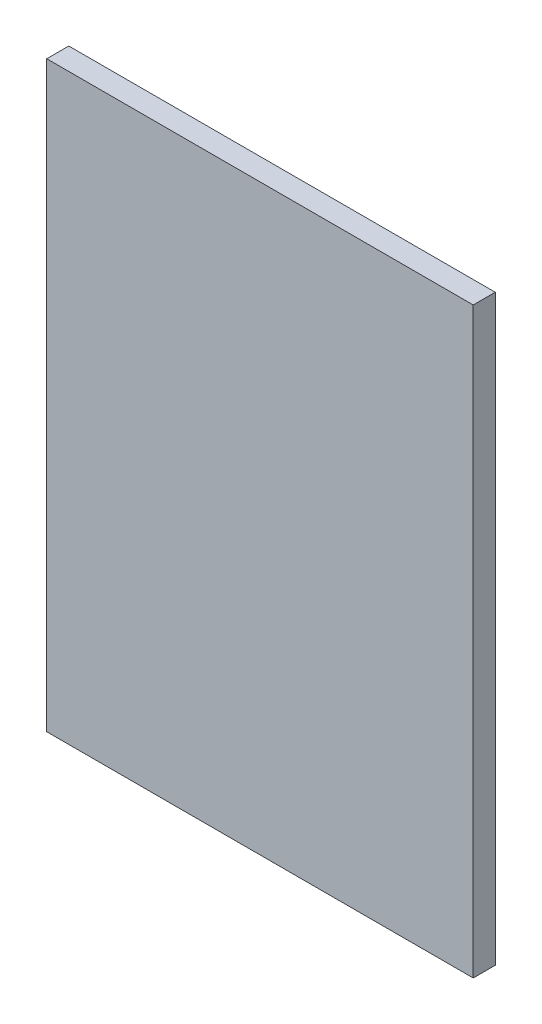
ISO-10303-21;
HEADER;
FILE_DESCRIPTION(('STEP AP214'),'2;1');
FILE_NAME('part.step','',(''),(''),'','','');
FILE_SCHEMA(('AUTOMOTIVE_DESIGN { 1 0 10303 214 1 1 1 1 }'));
ENDSEC;
DATA;
#1=APPLICATION_CONTEXT('core data for automotive mechanical design processes');
#2=APPLICATION_PROTOCOL_DEFINITION('international standard','automotive_design',2000,#1);
#3=PRODUCT_CONTEXT('',#1,'mechanical');
#4=PRODUCT('Part','Part','',(#3));
#5=PRODUCT_RELATED_PRODUCT_CATEGORY('part','',(#4));
#6=PRODUCT_DEFINITION_FORMATION('','',#4);
#7=PRODUCT_DEFINITION_CONTEXT('part definition',#1,'design');
#8=PRODUCT_DEFINITION('design','',#6,#7);
#9=PRODUCT_DEFINITION_SHAPE('','',#8);
#10=(LENGTH_UNIT() NAMED_UNIT(*) SI_UNIT(.MILLI.,.METRE.));
#11=(NAMED_UNIT(*) PLANE_ANGLE_UNIT() SI_UNIT($,.RADIAN.));
#12=(NAMED_UNIT(*) SI_UNIT($,.STERADIAN.) SOLID_ANGLE_UNIT());
#13=UNCERTAINTY_MEASURE_WITH_UNIT(LENGTH_MEASURE(1.E-05),#10,'distance_accuracy_value','');
#14=(GEOMETRIC_REPRESENTATION_CONTEXT(3) GLOBAL_UNCERTAINTY_ASSIGNED_CONTEXT((#13)) GLOBAL_UNIT_ASSIGNED_CONTEXT((#10,
#11,#12)) REPRESENTATION_CONTEXT('',''));
#15=CARTESIAN_POINT('',(0.,0.,0.));
#16=DIRECTION('',(0.,0.,1.));
#17=DIRECTION('',(1.,0.,0.));
#18=AXIS2_PLACEMENT_3D('',#15,#16,#17);
#19=CARTESIAN_POINT('',(-15.,20.5,1.55));
#20=DIRECTION('',(1.,0.,0.));
#21=DIRECTION('',(0.,1.,0.));
#22=AXIS2_PLACEMENT_3D('',#19,#20,#21);
#23=PLANE('',#22);
#24=DIRECTION('',(0.,-1.,0.));
#25=VECTOR('',#24,1.);
#26=CARTESIAN_POINT('',(-15.,20.5,0.));
#27=LINE('',#26,#25);
#28=CARTESIAN_POINT('',(-15.,20.5,0.));
#29=VERTEX_POINT('',#28);
#30=CARTESIAN_POINT('',(-15.,-20.5,0.));
#31=VERTEX_POINT('',#30);
#32=EDGE_CURVE('E98',#29,#31,#27,.T.);
#33=ORIENTED_EDGE('',*,*,#32,.T.);
#34=DIRECTION('',(0.,0.,-1.));
#35=VECTOR('',#34,1.);
#36=CARTESIAN_POINT('',(-15.,-20.5,1.55));
#37=LINE('',#36,#35);
#38=CARTESIAN_POINT('',(-15.,-20.5,1.55));
#39=VERTEX_POINT('',#38);
#40=EDGE_CURVE('E11',#39,#31,#37,.T.);
#41=ORIENTED_EDGE('',*,*,#40,.F.);
#42=DIRECTION('',(0.,-1.,0.));
#43=VECTOR('',#42,1.);
#44=CARTESIAN_POINT('',(-15.,20.5,1.55));
#45=LINE('',#44,#43);
#46=CARTESIAN_POINT('',(-15.,20.5,1.55));
#47=VERTEX_POINT('',#46);
#48=EDGE_CURVE('E86',#47,#39,#45,.T.);
#49=ORIENTED_EDGE('',*,*,#48,.F.);
#50=DIRECTION('',(0.,0.,-1.));
#51=VECTOR('',#50,1.);
#52=CARTESIAN_POINT('',(-15.,20.5,1.55));
#53=LINE('',#52,#51);
#54=EDGE_CURVE('E94',#47,#29,#53,.T.);
#55=ORIENTED_EDGE('',*,*,#54,.T.);
#56=EDGE_LOOP('',(#33,#41,#49,#55));
#57=FACE_BOUND('',#56,.T.);
#58=ADVANCED_FACE('F35',(#57),#23,.F.);
#59=CARTESIAN_POINT('',(15.,-20.5,1.55));
#60=DIRECTION('',(0.,1.,0.));
#61=DIRECTION('',(0.,0.,1.));
#62=AXIS2_PLACEMENT_3D('',#59,#60,#61);
#63=PLANE('',#62);
#64=DIRECTION('',(1.,0.,0.));
#65=VECTOR('',#64,1.);
#66=CARTESIAN_POINT('',(15.,-20.5,0.));
#67=LINE('',#66,#65);
#68=CARTESIAN_POINT('',(15.,-20.5,0.));
#69=VERTEX_POINT('',#68);
#70=EDGE_CURVE('E90',#31,#69,#67,.T.);
#71=ORIENTED_EDGE('',*,*,#70,.T.);
#72=DIRECTION('',(0.,0.,-1.));
#73=VECTOR('',#72,1.);
#74=CARTESIAN_POINT('',(15.,-20.5,1.55));
#75=LINE('',#74,#73);
#76=CARTESIAN_POINT('',(15.,-20.5,1.55));
#77=VERTEX_POINT('',#76);
#78=EDGE_CURVE('E43',#77,#69,#75,.T.);
#79=ORIENTED_EDGE('',*,*,#78,.F.);
#80=DIRECTION('',(1.,0.,0.));
#81=VECTOR('',#80,1.);
#82=CARTESIAN_POINT('',(15.,-20.5,1.55));
#83=LINE('',#82,#81);
#84=EDGE_CURVE('E81',#39,#77,#83,.T.);
#85=ORIENTED_EDGE('',*,*,#84,.F.);
#86=ORIENTED_EDGE('',*,*,#40,.T.);
#87=EDGE_LOOP('',(#71,#79,#85,#86));
#88=FACE_BOUND('',#87,.T.);
#89=ADVANCED_FACE('F89',(#88),#63,.F.);
#90=CARTESIAN_POINT('',(15.,20.5,1.55));
#91=DIRECTION('',(-1.,0.,0.));
#92=DIRECTION('',(0.,-1.,0.));
#93=AXIS2_PLACEMENT_3D('',#90,#91,#92);
#94=PLANE('',#93);
#95=DIRECTION('',(0.,1.,0.));
#96=VECTOR('',#95,1.);
#97=CARTESIAN_POINT('',(15.,20.5,0.));
#98=LINE('',#97,#96);
#99=CARTESIAN_POINT('',(15.,20.5,0.));
#100=VERTEX_POINT('',#99);
#101=EDGE_CURVE('E68',#69,#100,#98,.T.);
#102=ORIENTED_EDGE('',*,*,#101,.T.);
#103=DIRECTION('',(0.,0.,-1.));
#104=VECTOR('',#103,1.);
#105=CARTESIAN_POINT('',(15.,20.5,1.55));
#106=LINE('',#105,#104);
#107=CARTESIAN_POINT('',(15.,20.5,1.55));
#108=VERTEX_POINT('',#107);
#109=EDGE_CURVE('E91',#108,#100,#106,.T.);
#110=ORIENTED_EDGE('',*,*,#109,.F.);
#111=DIRECTION('',(0.,1.,0.));
#112=VECTOR('',#111,1.);
#113=CARTESIAN_POINT('',(15.,20.5,1.55));
#114=LINE('',#113,#112);
#115=EDGE_CURVE('E84',#77,#108,#114,.T.);
#116=ORIENTED_EDGE('',*,*,#115,.F.);
#117=ORIENTED_EDGE('',*,*,#78,.T.);
#118=EDGE_LOOP('',(#102,#110,#116,#117));
#119=FACE_BOUND('',#118,.T.);
#120=ADVANCED_FACE('F92',(#119),#94,.F.);
#121=CARTESIAN_POINT('',(15.,20.5,1.55));
#122=DIRECTION('',(0.,-1.,0.));
#123=DIRECTION('',(0.,0.,-1.));
#124=AXIS2_PLACEMENT_3D('',#121,#122,#123);
#125=PLANE('',#124);
#126=DIRECTION('',(-1.,0.,0.));
#127=VECTOR('',#126,1.);
#128=CARTESIAN_POINT('',(15.,20.5,0.));
#129=LINE('',#128,#127);
#130=EDGE_CURVE('E74',#100,#29,#129,.T.);
#131=ORIENTED_EDGE('',*,*,#130,.T.);
#132=ORIENTED_EDGE('',*,*,#54,.F.);
#133=DIRECTION('',(-1.,0.,0.));
#134=VECTOR('',#133,1.);
#135=CARTESIAN_POINT('',(15.,20.5,1.55));
#136=LINE('',#135,#134);
#137=EDGE_CURVE('E51',#108,#47,#136,.T.);
#138=ORIENTED_EDGE('',*,*,#137,.F.);
#139=ORIENTED_EDGE('',*,*,#109,.T.);
#140=EDGE_LOOP('',(#131,#132,#138,#139));
#141=FACE_BOUND('',#140,.T.);
#142=ADVANCED_FACE('F105',(#141),#125,.F.);
#143=CARTESIAN_POINT('',(0.,0.,1.55));
#144=DIRECTION('',(0.,0.,-1.));
#145=DIRECTION('',(-1.,0.,0.));
#146=AXIS2_PLACEMENT_3D('',#143,#144,#145);
#147=PLANE('',#146);
#148=ORIENTED_EDGE('',*,*,#48,.T.);
#149=ORIENTED_EDGE('',*,*,#84,.T.);
#150=ORIENTED_EDGE('',*,*,#115,.T.);
#151=ORIENTED_EDGE('',*,*,#137,.T.);
#152=EDGE_LOOP('',(#148,#149,#150,#151));
#153=FACE_BOUND('',#152,.T.);
#154=ADVANCED_FACE('F82',(#153),#147,.F.);
#155=CARTESIAN_POINT('',(0.,0.,0.));
#156=DIRECTION('',(0.,0.,-1.));
#157=DIRECTION('',(-1.,0.,0.));
#158=AXIS2_PLACEMENT_3D('',#155,#156,#157);
#159=PLANE('',#158);
#160=ORIENTED_EDGE('',*,*,#32,.F.);
#161=ORIENTED_EDGE('',*,*,#130,.F.);
#162=ORIENTED_EDGE('',*,*,#101,.F.);
#163=ORIENTED_EDGE('',*,*,#70,.F.);
#164=EDGE_LOOP('',(#160,#161,#162,#163));
#165=FACE_BOUND('',#164,.T.);
#166=ADVANCED_FACE('F108',(#165),#159,.T.);
#167=CLOSED_SHELL('',(#58,#89,#120,#142,#154,#166));
#168=MANIFOLD_SOLID_BREP('B2',#167);
#169=ADVANCED_BREP_SHAPE_REPRESENTATION('',(#18,#168),#14);
#170=SHAPE_DEFINITION_REPRESENTATION(#9,#169);
ENDSEC;
END-ISO-10303-21;
